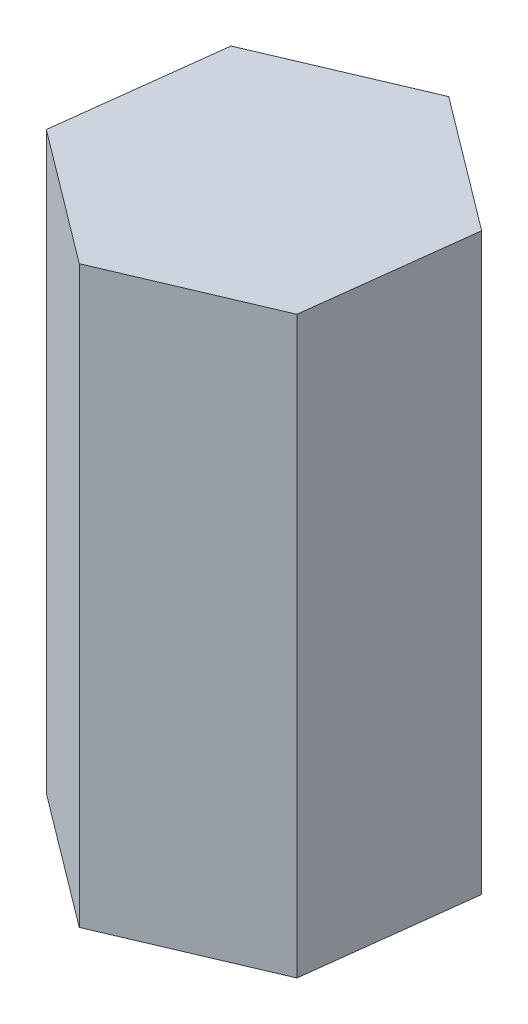
ISO-10303-21;
HEADER;
FILE_DESCRIPTION(('STEP AP214'),'2;1');
FILE_NAME('part.step','',(''),(''),'','','');
FILE_SCHEMA(('AUTOMOTIVE_DESIGN { 1 0 10303 214 1 1 1 1 }'));
ENDSEC;
DATA;
#1=APPLICATION_CONTEXT('core data for automotive mechanical design processes');
#2=APPLICATION_PROTOCOL_DEFINITION('international standard','automotive_design',2000,#1);
#3=PRODUCT_CONTEXT('',#1,'mechanical');
#4=PRODUCT('Part','Part','',(#3));
#5=PRODUCT_RELATED_PRODUCT_CATEGORY('part','',(#4));
#6=PRODUCT_DEFINITION_FORMATION('','',#4);
#7=PRODUCT_DEFINITION_CONTEXT('part definition',#1,'design');
#8=PRODUCT_DEFINITION('design','',#6,#7);
#9=PRODUCT_DEFINITION_SHAPE('','',#8);
#10=(LENGTH_UNIT() NAMED_UNIT(*) SI_UNIT(.MILLI.,.METRE.));
#11=(NAMED_UNIT(*) PLANE_ANGLE_UNIT() SI_UNIT($,.RADIAN.));
#12=(NAMED_UNIT(*) SI_UNIT($,.STERADIAN.) SOLID_ANGLE_UNIT());
#13=UNCERTAINTY_MEASURE_WITH_UNIT(LENGTH_MEASURE(1.E-05),#10,'distance_accuracy_value','');
#14=(GEOMETRIC_REPRESENTATION_CONTEXT(3) GLOBAL_UNCERTAINTY_ASSIGNED_CONTEXT((#13)) GLOBAL_UNIT_ASSIGNED_CONTEXT((#10,
#11,#12)) REPRESENTATION_CONTEXT('',''));
#15=CARTESIAN_POINT('',(0.,0.,0.));
#16=DIRECTION('',(0.,0.,1.));
#17=DIRECTION('',(1.,0.,0.));
#18=AXIS2_PLACEMENT_3D('',#15,#16,#17);
#19=CARTESIAN_POINT('',(-0.348459145534174,10.,2.86564295703896));
#20=DIRECTION('',(-0.391806176134086,0.,-0.920047781554407));
#21=DIRECTION('',(-0.920047781554407,0.,0.391806176134086));
#22=AXIS2_PLACEMENT_3D('',#19,#20,#21);
#23=PLANE('',#22);
#24=DIRECTION('',(0.920047781554407,0.,-0.391806176134086));
#25=VECTOR('',#24,1.);
#26=CARTESIAN_POINT('',(-0.348459145534174,0.,2.86564295703896));
#27=LINE('',#26,#25);
#28=CARTESIAN_POINT('',(-0.348459145534174,0.,2.86564295703896));
#29=VERTEX_POINT('',#28);
#30=CARTESIAN_POINT('',(2.30749002620461,0.,1.73459595073309));
#31=VERTEX_POINT('',#30);
#32=EDGE_CURVE('E128',#29,#31,#27,.T.);
#33=ORIENTED_EDGE('',*,*,#32,.T.);
#34=DIRECTION('',(0.,-1.,0.));
#35=VECTOR('',#34,1.);
#36=CARTESIAN_POINT('',(2.30749002620461,10.,1.73459595073309));
#37=LINE('',#36,#35);
#38=CARTESIAN_POINT('',(2.30749002620461,10.,1.73459595073309));
#39=VERTEX_POINT('',#38);
#40=EDGE_CURVE('E11',#39,#31,#37,.T.);
#41=ORIENTED_EDGE('',*,*,#40,.F.);
#42=DIRECTION('',(0.920047781554407,0.,-0.391806176134086));
#43=VECTOR('',#42,1.);
#44=CARTESIAN_POINT('',(-0.348459145534174,10.,2.86564295703896));
#45=LINE('',#44,#43);
#46=CARTESIAN_POINT('',(-0.348459145534174,10.,2.86564295703896));
#47=VERTEX_POINT('',#46);
#48=EDGE_CURVE('E144',#47,#39,#45,.T.);
#49=ORIENTED_EDGE('',*,*,#48,.F.);
#50=DIRECTION('',(0.,-1.,0.));
#51=VECTOR('',#50,1.);
#52=CARTESIAN_POINT('',(-0.348459145534174,10.,2.86564295703896));
#53=LINE('',#52,#51);
#54=EDGE_CURVE('E124',#47,#29,#53,.T.);
#55=ORIENTED_EDGE('',*,*,#54,.T.);
#56=EDGE_LOOP('',(#33,#41,#49,#55));
#57=FACE_BOUND('',#56,.T.);
#58=ADVANCED_FACE('F39',(#57),#23,.F.);
#59=CARTESIAN_POINT('',(2.30749002620461,10.,1.73459595073309));
#60=DIRECTION('',(-0.992687839588675,0.,-0.120709788885445));
#61=DIRECTION('',(-0.120709788885445,0.,0.992687839588675));
#62=AXIS2_PLACEMENT_3D('',#59,#60,#61);
#63=PLANE('',#62);
#64=DIRECTION('',(0.120709788885445,0.,-0.992687839588675));
#65=VECTOR('',#64,1.);
#66=CARTESIAN_POINT('',(2.30749002620461,0.,1.73459595073309));
#67=LINE('',#66,#65);
#68=CARTESIAN_POINT('',(2.65594917173878,0.,-1.13104700630588));
#69=VERTEX_POINT('',#68);
#70=EDGE_CURVE('E132',#31,#69,#67,.T.);
#71=ORIENTED_EDGE('',*,*,#70,.T.);
#72=DIRECTION('',(0.,-1.,0.));
#73=VECTOR('',#72,1.);
#74=CARTESIAN_POINT('',(2.65594917173878,10.,-1.13104700630588));
#75=LINE('',#74,#73);
#76=CARTESIAN_POINT('',(2.65594917173878,10.,-1.13104700630588));
#77=VERTEX_POINT('',#76);
#78=EDGE_CURVE('E48',#77,#69,#75,.T.);
#79=ORIENTED_EDGE('',*,*,#78,.F.);
#80=DIRECTION('',(0.120709788885445,0.,-0.992687839588675));
#81=VECTOR('',#80,1.);
#82=CARTESIAN_POINT('',(2.30749002620461,10.,1.73459595073309));
#83=LINE('',#82,#81);
#84=EDGE_CURVE('E93',#39,#77,#83,.T.);
#85=ORIENTED_EDGE('',*,*,#84,.F.);
#86=ORIENTED_EDGE('',*,*,#40,.T.);
#87=EDGE_LOOP('',(#71,#79,#85,#86));
#88=FACE_BOUND('',#87,.T.);
#89=ADVANCED_FACE('F172',(#88),#63,.F.);
#90=CARTESIAN_POINT('',(2.65594917173878,10.,-1.13104700630588));
#91=DIRECTION('',(-0.60088166345459,0.,0.799337992668962));
#92=DIRECTION('',(0.799337992668962,0.,0.60088166345459));
#93=AXIS2_PLACEMENT_3D('',#90,#91,#92);
#94=PLANE('',#93);
#95=DIRECTION('',(-0.799337992668962,0.,-0.60088166345459));
#96=VECTOR('',#95,1.);
#97=CARTESIAN_POINT('',(2.65594917173878,0.,-1.13104700630588));
#98=LINE('',#97,#96);
#99=CARTESIAN_POINT('',(0.34845914553417,0.,-2.86564295703897));
#100=VERTEX_POINT('',#99);
#101=EDGE_CURVE('E135',#69,#100,#98,.T.);
#102=ORIENTED_EDGE('',*,*,#101,.T.);
#103=DIRECTION('',(0.,-1.,0.));
#104=VECTOR('',#103,1.);
#105=CARTESIAN_POINT('',(0.34845914553417,10.,-2.86564295703897));
#106=LINE('',#105,#104);
#107=CARTESIAN_POINT('',(0.34845914553417,10.,-2.86564295703897));
#108=VERTEX_POINT('',#107);
#109=EDGE_CURVE('E117',#108,#100,#106,.T.);
#110=ORIENTED_EDGE('',*,*,#109,.F.);
#111=DIRECTION('',(-0.799337992668962,0.,-0.60088166345459));
#112=VECTOR('',#111,1.);
#113=CARTESIAN_POINT('',(2.65594917173878,10.,-1.13104700630588));
#114=LINE('',#113,#112);
#115=EDGE_CURVE('E106',#77,#108,#114,.T.);
#116=ORIENTED_EDGE('',*,*,#115,.F.);
#117=ORIENTED_EDGE('',*,*,#78,.T.);
#118=EDGE_LOOP('',(#102,#110,#116,#117));
#119=FACE_BOUND('',#118,.T.);
#120=ADVANCED_FACE('F154',(#119),#94,.F.);
#121=CARTESIAN_POINT('',(0.34845914553417,10.,-2.86564295703897));
#122=DIRECTION('',(0.391806176134086,0.,0.920047781554407));
#123=DIRECTION('',(0.920047781554407,0.,-0.391806176134086));
#124=AXIS2_PLACEMENT_3D('',#121,#122,#123);
#125=PLANE('',#124);
#126=DIRECTION('',(-0.920047781554407,0.,0.391806176134086));
#127=VECTOR('',#126,1.);
#128=CARTESIAN_POINT('',(0.34845914553417,0.,-2.86564295703897));
#129=LINE('',#128,#127);
#130=CARTESIAN_POINT('',(-2.30749002620461,0.,-1.73459595073311));
#131=VERTEX_POINT('',#130);
#132=EDGE_CURVE('E115',#100,#131,#129,.T.);
#133=ORIENTED_EDGE('',*,*,#132,.T.);
#134=DIRECTION('',(0.,-1.,0.));
#135=VECTOR('',#134,1.);
#136=CARTESIAN_POINT('',(-2.30749002620461,10.,-1.73459595073311));
#137=LINE('',#136,#135);
#138=CARTESIAN_POINT('',(-2.30749002620461,10.,-1.73459595073311));
#139=VERTEX_POINT('',#138);
#140=EDGE_CURVE('E112',#139,#131,#137,.T.);
#141=ORIENTED_EDGE('',*,*,#140,.F.);
#142=DIRECTION('',(-0.920047781554407,0.,0.391806176134086));
#143=VECTOR('',#142,1.);
#144=CARTESIAN_POINT('',(0.34845914553417,10.,-2.86564295703897));
#145=LINE('',#144,#143);
#146=EDGE_CURVE('E100',#108,#139,#145,.T.);
#147=ORIENTED_EDGE('',*,*,#146,.F.);
#148=ORIENTED_EDGE('',*,*,#109,.T.);
#149=EDGE_LOOP('',(#133,#141,#147,#148));
#150=FACE_BOUND('',#149,.T.);
#151=ADVANCED_FACE('F113',(#150),#125,.F.);
#152=CARTESIAN_POINT('',(-2.30749002620461,10.,-1.73459595073311));
#153=DIRECTION('',(0.992687839588675,0.,0.120709788885444));
#154=DIRECTION('',(0.120709788885444,0.,-0.992687839588675));
#155=AXIS2_PLACEMENT_3D('',#152,#153,#154);
#156=PLANE('',#155);
#157=DIRECTION('',(-0.120709788885444,0.,0.992687839588675));
#158=VECTOR('',#157,1.);
#159=CARTESIAN_POINT('',(-2.30749002620461,0.,-1.73459595073311));
#160=LINE('',#159,#158);
#161=CARTESIAN_POINT('',(-2.65594917173878,0.,1.13104700630586));
#162=VERTEX_POINT('',#161);
#163=EDGE_CURVE('E79',#131,#162,#160,.T.);
#164=ORIENTED_EDGE('',*,*,#163,.T.);
#165=DIRECTION('',(0.,-1.,0.));
#166=VECTOR('',#165,1.);
#167=CARTESIAN_POINT('',(-2.65594917173878,10.,1.13104700630586));
#168=LINE('',#167,#166);
#169=CARTESIAN_POINT('',(-2.65594917173878,10.,1.13104700630586));
#170=VERTEX_POINT('',#169);
#171=EDGE_CURVE('E118',#170,#162,#168,.T.);
#172=ORIENTED_EDGE('',*,*,#171,.F.);
#173=DIRECTION('',(-0.120709788885444,0.,0.992687839588675));
#174=VECTOR('',#173,1.);
#175=CARTESIAN_POINT('',(-2.30749002620461,10.,-1.73459595073311));
#176=LINE('',#175,#174);
#177=EDGE_CURVE('E104',#139,#170,#176,.T.);
#178=ORIENTED_EDGE('',*,*,#177,.F.);
#179=ORIENTED_EDGE('',*,*,#140,.T.);
#180=EDGE_LOOP('',(#164,#172,#178,#179));
#181=FACE_BOUND('',#180,.T.);
#182=ADVANCED_FACE('F120',(#181),#156,.F.);
#183=CARTESIAN_POINT('',(-2.65594917173878,10.,1.13104700630586));
#184=DIRECTION('',(0.600881663454589,0.,-0.799337992668962));
#185=DIRECTION('',(-0.799337992668962,0.,-0.600881663454589));
#186=AXIS2_PLACEMENT_3D('',#183,#184,#185);
#187=PLANE('',#186);
#188=DIRECTION('',(0.799337992668962,0.,0.600881663454589));
#189=VECTOR('',#188,1.);
#190=CARTESIAN_POINT('',(-2.65594917173878,0.,1.13104700630586));
#191=LINE('',#190,#189);
#192=EDGE_CURVE('E85',#162,#29,#191,.T.);
#193=ORIENTED_EDGE('',*,*,#192,.T.);
#194=ORIENTED_EDGE('',*,*,#54,.F.);
#195=DIRECTION('',(0.799337992668962,0.,0.600881663454589));
#196=VECTOR('',#195,1.);
#197=CARTESIAN_POINT('',(-2.65594917173878,10.,1.13104700630586));
#198=LINE('',#197,#196);
#199=EDGE_CURVE('E56',#170,#47,#198,.T.);
#200=ORIENTED_EDGE('',*,*,#199,.F.);
#201=ORIENTED_EDGE('',*,*,#171,.T.);
#202=EDGE_LOOP('',(#193,#194,#200,#201));
#203=FACE_BOUND('',#202,.T.);
#204=ADVANCED_FACE('F161',(#203),#187,.F.);
#205=CARTESIAN_POINT('',(0.,10.,0.));
#206=DIRECTION('',(0.,1.,0.));
#207=DIRECTION('',(0.,0.,1.));
#208=AXIS2_PLACEMENT_3D('',#205,#206,#207);
#209=PLANE('',#208);
#210=ORIENTED_EDGE('',*,*,#48,.T.);
#211=ORIENTED_EDGE('',*,*,#84,.T.);
#212=ORIENTED_EDGE('',*,*,#115,.T.);
#213=ORIENTED_EDGE('',*,*,#146,.T.);
#214=ORIENTED_EDGE('',*,*,#177,.T.);
#215=ORIENTED_EDGE('',*,*,#199,.T.);
#216=EDGE_LOOP('',(#210,#211,#212,#213,#214,#215));
#217=FACE_BOUND('',#216,.T.);
#218=ADVANCED_FACE('F102',(#217),#209,.T.);
#219=CARTESIAN_POINT('',(0.,0.,0.));
#220=DIRECTION('',(0.,1.,0.));
#221=DIRECTION('',(0.,0.,1.));
#222=AXIS2_PLACEMENT_3D('',#219,#220,#221);
#223=PLANE('',#222);
#224=ORIENTED_EDGE('',*,*,#32,.F.);
#225=ORIENTED_EDGE('',*,*,#192,.F.);
#226=ORIENTED_EDGE('',*,*,#163,.F.);
#227=ORIENTED_EDGE('',*,*,#132,.F.);
#228=ORIENTED_EDGE('',*,*,#101,.F.);
#229=ORIENTED_EDGE('',*,*,#70,.F.);
#230=EDGE_LOOP('',(#224,#225,#226,#227,#228,#229));
#231=FACE_BOUND('',#230,.T.);
#232=ADVANCED_FACE('F157',(#231),#223,.F.);
#233=CLOSED_SHELL('',(#58,#89,#120,#151,#182,#204,#218,#232));
#234=MANIFOLD_SOLID_BREP('B2',#233);
#235=ADVANCED_BREP_SHAPE_REPRESENTATION('',(#18,#234),#14);
#236=SHAPE_DEFINITION_REPRESENTATION(#9,#235);
ENDSEC;
END-ISO-10303-21;
